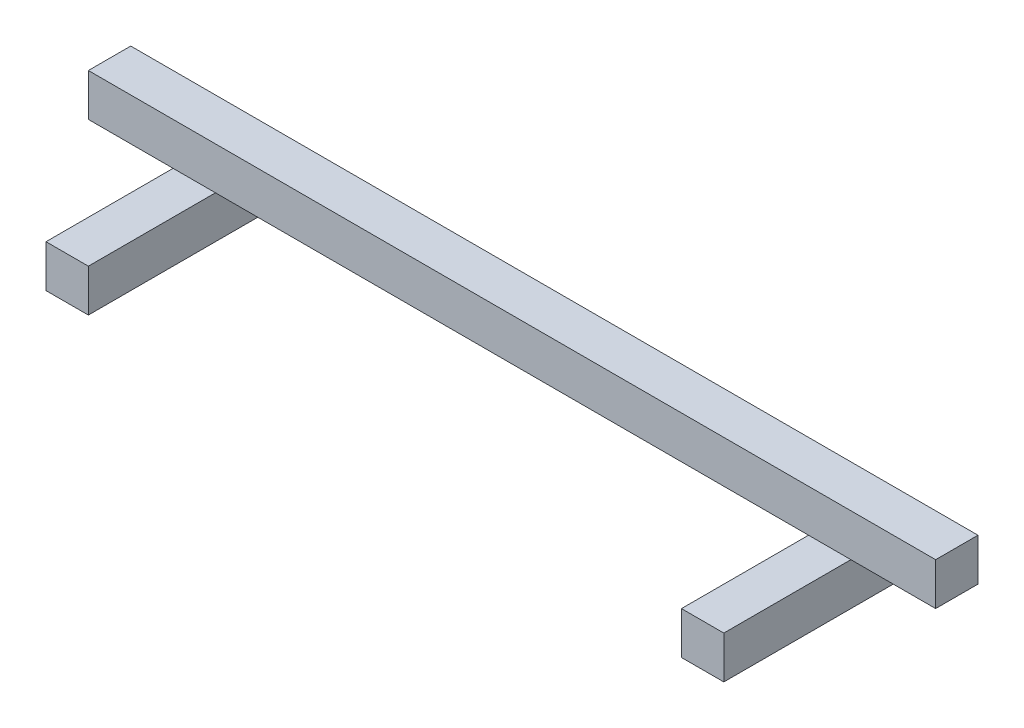
ISO-10303-21;
HEADER;
FILE_DESCRIPTION(('STEP AP214'),'2;1');
FILE_NAME('part.step','',(''),(''),'','','');
FILE_SCHEMA(('AUTOMOTIVE_DESIGN { 1 0 10303 214 1 1 1 1 }'));
ENDSEC;
DATA;
#1=APPLICATION_CONTEXT('core data for automotive mechanical design processes');
#2=APPLICATION_PROTOCOL_DEFINITION('international standard','automotive_design',2000,#1);
#3=PRODUCT_CONTEXT('',#1,'mechanical');
#4=PRODUCT('Part','Part','',(#3));
#5=PRODUCT_RELATED_PRODUCT_CATEGORY('part','',(#4));
#6=PRODUCT_DEFINITION_FORMATION('','',#4);
#7=PRODUCT_DEFINITION_CONTEXT('part definition',#1,'design');
#8=PRODUCT_DEFINITION('design','',#6,#7);
#9=PRODUCT_DEFINITION_SHAPE('','',#8);
#10=(LENGTH_UNIT() NAMED_UNIT(*) SI_UNIT(.MILLI.,.METRE.));
#11=(NAMED_UNIT(*) PLANE_ANGLE_UNIT() SI_UNIT($,.RADIAN.));
#12=(NAMED_UNIT(*) SI_UNIT($,.STERADIAN.) SOLID_ANGLE_UNIT());
#13=UNCERTAINTY_MEASURE_WITH_UNIT(LENGTH_MEASURE(1.E-05),#10,'distance_accuracy_value','');
#14=(GEOMETRIC_REPRESENTATION_CONTEXT(3) GLOBAL_UNCERTAINTY_ASSIGNED_CONTEXT((#13)) GLOBAL_UNIT_ASSIGNED_CONTEXT((#10,
#11,#12)) REPRESENTATION_CONTEXT('',''));
#15=CARTESIAN_POINT('',(0.,0.,0.));
#16=DIRECTION('',(0.,0.,1.));
#17=DIRECTION('',(1.,0.,0.));
#18=AXIS2_PLACEMENT_3D('',#15,#16,#17);
#19=CARTESIAN_POINT('',(304.8,0.,133.35));
#20=DIRECTION('',(0.,-1.,0.));
#21=DIRECTION('',(1.,0.,0.));
#22=AXIS2_PLACEMENT_3D('',#19,#20,#21);
#23=PLANE('',#22);
#24=DIRECTION('',(-1.,0.,0.));
#25=VECTOR('',#24,1.);
#26=CARTESIAN_POINT('',(304.8,0.,-19.05));
#27=LINE('',#26,#25);
#28=CARTESIAN_POINT('',(304.8,0.,-19.05));
#29=VERTEX_POINT('',#28);
#30=CARTESIAN_POINT('',(266.7,0.,-19.05));
#31=VERTEX_POINT('',#30);
#32=EDGE_CURVE('E107',#29,#31,#27,.T.);
#33=ORIENTED_EDGE('',*,*,#32,.T.);
#34=DIRECTION('',(0.,0.,-1.));
#35=VECTOR('',#34,1.);
#36=CARTESIAN_POINT('',(266.7,0.,133.35));
#37=LINE('',#36,#35);
#38=CARTESIAN_POINT('',(266.7,0.,133.35));
#39=VERTEX_POINT('',#38);
#40=EDGE_CURVE('E12',#39,#31,#37,.T.);
#41=ORIENTED_EDGE('',*,*,#40,.F.);
#42=DIRECTION('',(-1.,0.,0.));
#43=VECTOR('',#42,1.);
#44=CARTESIAN_POINT('',(304.8,0.,133.35));
#45=LINE('',#44,#43);
#46=CARTESIAN_POINT('',(304.8,0.,133.35));
#47=VERTEX_POINT('',#46);
#48=EDGE_CURVE('E95',#47,#39,#45,.T.);
#49=ORIENTED_EDGE('',*,*,#48,.F.);
#50=DIRECTION('',(0.,0.,-1.));
#51=VECTOR('',#50,1.);
#52=CARTESIAN_POINT('',(304.8,0.,133.35));
#53=LINE('',#52,#51);
#54=EDGE_CURVE('E103',#47,#29,#53,.T.);
#55=ORIENTED_EDGE('',*,*,#54,.T.);
#56=EDGE_LOOP('',(#33,#41,#49,#55));
#57=FACE_BOUND('',#56,.T.);
#58=ADVANCED_FACE('F44',(#57),#23,.F.);
#59=CARTESIAN_POINT('',(266.7,0.,133.35));
#60=DIRECTION('',(1.,0.,0.));
#61=DIRECTION('',(0.,0.,-1.));
#62=AXIS2_PLACEMENT_3D('',#59,#60,#61);
#63=PLANE('',#62);
#64=DIRECTION('',(0.,-1.,0.));
#65=VECTOR('',#64,1.);
#66=CARTESIAN_POINT('',(266.7,0.,-19.05));
#67=LINE('',#66,#65);
#68=CARTESIAN_POINT('',(266.7,-38.0999999999999,-19.05));
#69=VERTEX_POINT('',#68);
#70=EDGE_CURVE('E99',#31,#69,#67,.T.);
#71=ORIENTED_EDGE('',*,*,#70,.T.);
#72=DIRECTION('',(0.,0.,-1.));
#73=VECTOR('',#72,1.);
#74=CARTESIAN_POINT('',(266.7,-38.0999999999999,133.35));
#75=LINE('',#74,#73);
#76=CARTESIAN_POINT('',(266.7,-38.0999999999999,133.35));
#77=VERTEX_POINT('',#76);
#78=EDGE_CURVE('E52',#77,#69,#75,.T.);
#79=ORIENTED_EDGE('',*,*,#78,.F.);
#80=DIRECTION('',(0.,-1.,0.));
#81=VECTOR('',#80,1.);
#82=CARTESIAN_POINT('',(266.7,0.,133.35));
#83=LINE('',#82,#81);
#84=EDGE_CURVE('E90',#39,#77,#83,.T.);
#85=ORIENTED_EDGE('',*,*,#84,.F.);
#86=ORIENTED_EDGE('',*,*,#40,.T.);
#87=EDGE_LOOP('',(#71,#79,#85,#86));
#88=FACE_BOUND('',#87,.T.);
#89=ADVANCED_FACE('F98',(#88),#63,.F.);
#90=CARTESIAN_POINT('',(304.8,-38.0999999999999,133.35));
#91=DIRECTION('',(0.,1.,0.));
#92=DIRECTION('',(-1.,0.,0.));
#93=AXIS2_PLACEMENT_3D('',#90,#91,#92);
#94=PLANE('',#93);
#95=DIRECTION('',(1.,0.,0.));
#96=VECTOR('',#95,1.);
#97=CARTESIAN_POINT('',(304.8,-38.0999999999999,-19.05));
#98=LINE('',#97,#96);
#99=CARTESIAN_POINT('',(304.8,-38.0999999999999,-19.05));
#100=VERTEX_POINT('',#99);
#101=EDGE_CURVE('E77',#69,#100,#98,.T.);
#102=ORIENTED_EDGE('',*,*,#101,.T.);
#103=DIRECTION('',(0.,0.,-1.));
#104=VECTOR('',#103,1.);
#105=CARTESIAN_POINT('',(304.8,-38.0999999999999,133.35));
#106=LINE('',#105,#104);
#107=CARTESIAN_POINT('',(304.8,-38.0999999999999,133.35));
#108=VERTEX_POINT('',#107);
#109=EDGE_CURVE('E100',#108,#100,#106,.T.);
#110=ORIENTED_EDGE('',*,*,#109,.F.);
#111=DIRECTION('',(1.,0.,0.));
#112=VECTOR('',#111,1.);
#113=CARTESIAN_POINT('',(304.8,-38.0999999999999,133.35));
#114=LINE('',#113,#112);
#115=EDGE_CURVE('E93',#77,#108,#114,.T.);
#116=ORIENTED_EDGE('',*,*,#115,.F.);
#117=ORIENTED_EDGE('',*,*,#78,.T.);
#118=EDGE_LOOP('',(#102,#110,#116,#117));
#119=FACE_BOUND('',#118,.T.);
#120=ADVANCED_FACE('F101',(#119),#94,.F.);
#121=CARTESIAN_POINT('',(304.8,0.,133.35));
#122=DIRECTION('',(-1.,0.,0.));
#123=DIRECTION('',(0.,0.,1.));
#124=AXIS2_PLACEMENT_3D('',#121,#122,#123);
#125=PLANE('',#124);
#126=DIRECTION('',(0.,1.,0.));
#127=VECTOR('',#126,1.);
#128=CARTESIAN_POINT('',(304.8,0.,-19.05));
#129=LINE('',#128,#127);
#130=EDGE_CURVE('E83',#100,#29,#129,.T.);
#131=ORIENTED_EDGE('',*,*,#130,.T.);
#132=ORIENTED_EDGE('',*,*,#54,.F.);
#133=DIRECTION('',(0.,1.,0.));
#134=VECTOR('',#133,1.);
#135=CARTESIAN_POINT('',(304.8,0.,133.35));
#136=LINE('',#135,#134);
#137=EDGE_CURVE('E60',#108,#47,#136,.T.);
#138=ORIENTED_EDGE('',*,*,#137,.F.);
#139=ORIENTED_EDGE('',*,*,#109,.T.);
#140=EDGE_LOOP('',(#131,#132,#138,#139));
#141=FACE_BOUND('',#140,.T.);
#142=ADVANCED_FACE('F114',(#141),#125,.F.);
#143=CARTESIAN_POINT('',(0.,0.,133.35));
#144=DIRECTION('',(0.,0.,1.));
#145=DIRECTION('',(1.,0.,0.));
#146=AXIS2_PLACEMENT_3D('',#143,#144,#145);
#147=PLANE('',#146);
#148=ORIENTED_EDGE('',*,*,#48,.T.);
#149=ORIENTED_EDGE('',*,*,#84,.T.);
#150=ORIENTED_EDGE('',*,*,#115,.T.);
#151=ORIENTED_EDGE('',*,*,#137,.T.);
#152=EDGE_LOOP('',(#148,#149,#150,#151));
#153=FACE_BOUND('',#152,.T.);
#154=ADVANCED_FACE('F91',(#153),#147,.T.);
#155=CARTESIAN_POINT('',(0.,0.,-19.05));
#156=DIRECTION('',(0.,0.,1.));
#157=DIRECTION('',(1.,0.,0.));
#158=AXIS2_PLACEMENT_3D('',#155,#156,#157);
#159=PLANE('',#158);
#160=ORIENTED_EDGE('',*,*,#32,.F.);
#161=ORIENTED_EDGE('',*,*,#130,.F.);
#162=ORIENTED_EDGE('',*,*,#101,.F.);
#163=ORIENTED_EDGE('',*,*,#70,.F.);
#164=EDGE_LOOP('',(#160,#161,#162,#163));
#165=FACE_BOUND('',#164,.T.);
#166=ADVANCED_FACE('F117',(#165),#159,.F.);
#167=CLOSED_SHELL('',(#58,#89,#120,#142,#154,#166));
#168=MANIFOLD_SOLID_BREP('B2',#167);
#169=CARTESIAN_POINT('',(-304.8,0.,133.35));
#170=DIRECTION('',(1.,0.,0.));
#171=DIRECTION('',(0.,0.,-1.));
#172=AXIS2_PLACEMENT_3D('',#169,#170,#171);
#173=PLANE('',#172);
#174=DIRECTION('',(0.,-1.,0.));
#175=VECTOR('',#174,1.);
#176=CARTESIAN_POINT('',(-304.8,0.,-19.05));
#177=LINE('',#176,#175);
#178=CARTESIAN_POINT('',(-304.8,0.,-19.05));
#179=VERTEX_POINT('',#178);
#180=CARTESIAN_POINT('',(-304.8,-38.1,-19.05));
#181=VERTEX_POINT('',#180);
#182=EDGE_CURVE('E240',#179,#181,#177,.T.);
#183=ORIENTED_EDGE('',*,*,#182,.T.);
#184=DIRECTION('',(0.,0.,-1.));
#185=VECTOR('',#184,1.);
#186=CARTESIAN_POINT('',(-304.8,-38.1,133.35));
#187=LINE('',#186,#185);
#188=CARTESIAN_POINT('',(-304.8,-38.1,133.35));
#189=VERTEX_POINT('',#188);
#190=EDGE_CURVE('E42',#189,#181,#187,.T.);
#191=ORIENTED_EDGE('',*,*,#190,.F.);
#192=DIRECTION('',(0.,-1.,0.));
#193=VECTOR('',#192,1.);
#194=CARTESIAN_POINT('',(-304.8,0.,133.35));
#195=LINE('',#194,#193);
#196=CARTESIAN_POINT('',(-304.8,0.,133.35));
#197=VERTEX_POINT('',#196);
#198=EDGE_CURVE('E228',#197,#189,#195,.T.);
#199=ORIENTED_EDGE('',*,*,#198,.F.);
#200=DIRECTION('',(0.,0.,-1.));
#201=VECTOR('',#200,1.);
#202=CARTESIAN_POINT('',(-304.8,0.,133.35));
#203=LINE('',#202,#201);
#204=EDGE_CURVE('E236',#197,#179,#203,.T.);
#205=ORIENTED_EDGE('',*,*,#204,.T.);
#206=EDGE_LOOP('',(#183,#191,#199,#205));
#207=FACE_BOUND('',#206,.T.);
#208=ADVANCED_FACE('F177',(#207),#173,.F.);
#209=CARTESIAN_POINT('',(-304.8,-38.1,133.35));
#210=DIRECTION('',(0.,1.,0.));
#211=DIRECTION('',(0.,0.,1.));
#212=AXIS2_PLACEMENT_3D('',#209,#210,#211);
#213=PLANE('',#212);
#214=DIRECTION('',(1.,0.,0.));
#215=VECTOR('',#214,1.);
#216=CARTESIAN_POINT('',(-304.8,-38.1,-19.05));
#217=LINE('',#216,#215);
#218=CARTESIAN_POINT('',(-266.7,-38.1,-19.05));
#219=VERTEX_POINT('',#218);
#220=EDGE_CURVE('E232',#181,#219,#217,.T.);
#221=ORIENTED_EDGE('',*,*,#220,.T.);
#222=DIRECTION('',(0.,0.,-1.));
#223=VECTOR('',#222,1.);
#224=CARTESIAN_POINT('',(-266.7,-38.1,133.35));
#225=LINE('',#224,#223);
#226=CARTESIAN_POINT('',(-266.7,-38.1,133.35));
#227=VERTEX_POINT('',#226);
#228=EDGE_CURVE('E185',#227,#219,#225,.T.);
#229=ORIENTED_EDGE('',*,*,#228,.F.);
#230=DIRECTION('',(1.,0.,0.));
#231=VECTOR('',#230,1.);
#232=CARTESIAN_POINT('',(-304.8,-38.1,133.35));
#233=LINE('',#232,#231);
#234=EDGE_CURVE('E223',#189,#227,#233,.T.);
#235=ORIENTED_EDGE('',*,*,#234,.F.);
#236=ORIENTED_EDGE('',*,*,#190,.T.);
#237=EDGE_LOOP('',(#221,#229,#235,#236));
#238=FACE_BOUND('',#237,.T.);
#239=ADVANCED_FACE('F231',(#238),#213,.F.);
#240=CARTESIAN_POINT('',(-266.7,0.,133.35));
#241=DIRECTION('',(-1.,0.,0.));
#242=DIRECTION('',(0.,0.,1.));
#243=AXIS2_PLACEMENT_3D('',#240,#241,#242);
#244=PLANE('',#243);
#245=DIRECTION('',(0.,1.,0.));
#246=VECTOR('',#245,1.);
#247=CARTESIAN_POINT('',(-266.7,0.,-19.05));
#248=LINE('',#247,#246);
#249=CARTESIAN_POINT('',(-266.7,0.,-19.05));
#250=VERTEX_POINT('',#249);
#251=EDGE_CURVE('E210',#219,#250,#248,.T.);
#252=ORIENTED_EDGE('',*,*,#251,.T.);
#253=DIRECTION('',(0.,0.,-1.));
#254=VECTOR('',#253,1.);
#255=CARTESIAN_POINT('',(-266.7,0.,133.35));
#256=LINE('',#255,#254);
#257=CARTESIAN_POINT('',(-266.7,0.,133.35));
#258=VERTEX_POINT('',#257);
#259=EDGE_CURVE('E233',#258,#250,#256,.T.);
#260=ORIENTED_EDGE('',*,*,#259,.F.);
#261=DIRECTION('',(0.,1.,0.));
#262=VECTOR('',#261,1.);
#263=CARTESIAN_POINT('',(-266.7,0.,133.35));
#264=LINE('',#263,#262);
#265=EDGE_CURVE('E226',#227,#258,#264,.T.);
#266=ORIENTED_EDGE('',*,*,#265,.F.);
#267=ORIENTED_EDGE('',*,*,#228,.T.);
#268=EDGE_LOOP('',(#252,#260,#266,#267));
#269=FACE_BOUND('',#268,.T.);
#270=ADVANCED_FACE('F234',(#269),#244,.F.);
#271=CARTESIAN_POINT('',(-304.8,0.,133.35));
#272=DIRECTION('',(0.,-1.,0.));
#273=DIRECTION('',(0.,0.,-1.));
#274=AXIS2_PLACEMENT_3D('',#271,#272,#273);
#275=PLANE('',#274);
#276=DIRECTION('',(-1.,0.,0.));
#277=VECTOR('',#276,1.);
#278=CARTESIAN_POINT('',(-304.8,0.,-19.05));
#279=LINE('',#278,#277);
#280=EDGE_CURVE('E216',#250,#179,#279,.T.);
#281=ORIENTED_EDGE('',*,*,#280,.T.);
#282=ORIENTED_EDGE('',*,*,#204,.F.);
#283=DIRECTION('',(-1.,0.,0.));
#284=VECTOR('',#283,1.);
#285=CARTESIAN_POINT('',(-304.8,0.,133.35));
#286=LINE('',#285,#284);
#287=EDGE_CURVE('E193',#258,#197,#286,.T.);
#288=ORIENTED_EDGE('',*,*,#287,.F.);
#289=ORIENTED_EDGE('',*,*,#259,.T.);
#290=EDGE_LOOP('',(#281,#282,#288,#289));
#291=FACE_BOUND('',#290,.T.);
#292=ADVANCED_FACE('F247',(#291),#275,.F.);
#293=CARTESIAN_POINT('',(0.,0.,133.35));
#294=DIRECTION('',(0.,0.,1.));
#295=DIRECTION('',(1.,0.,0.));
#296=AXIS2_PLACEMENT_3D('',#293,#294,#295);
#297=PLANE('',#296);
#298=ORIENTED_EDGE('',*,*,#198,.T.);
#299=ORIENTED_EDGE('',*,*,#234,.T.);
#300=ORIENTED_EDGE('',*,*,#265,.T.);
#301=ORIENTED_EDGE('',*,*,#287,.T.);
#302=EDGE_LOOP('',(#298,#299,#300,#301));
#303=FACE_BOUND('',#302,.T.);
#304=ADVANCED_FACE('F224',(#303),#297,.T.);
#305=CARTESIAN_POINT('',(0.,0.,-19.05));
#306=DIRECTION('',(0.,0.,1.));
#307=DIRECTION('',(1.,0.,0.));
#308=AXIS2_PLACEMENT_3D('',#305,#306,#307);
#309=PLANE('',#308);
#310=ORIENTED_EDGE('',*,*,#182,.F.);
#311=ORIENTED_EDGE('',*,*,#280,.F.);
#312=ORIENTED_EDGE('',*,*,#251,.F.);
#313=ORIENTED_EDGE('',*,*,#220,.F.);
#314=EDGE_LOOP('',(#310,#311,#312,#313));
#315=FACE_BOUND('',#314,.T.);
#316=ADVANCED_FACE('F250',(#315),#309,.F.);
#317=CLOSED_SHELL('',(#208,#239,#270,#292,#304,#316));
#318=MANIFOLD_SOLID_BREP('B6',#317);
#319=CARTESIAN_POINT('',(-381.,38.1,-19.05));
#320=DIRECTION('',(1.,0.,0.));
#321=DIRECTION('',(0.,0.,-1.));
#322=AXIS2_PLACEMENT_3D('',#319,#320,#321);
#323=PLANE('',#322);
#324=DIRECTION('',(0.,0.,1.));
#325=VECTOR('',#324,1.);
#326=CARTESIAN_POINT('',(-381.,0.,-19.05));
#327=LINE('',#326,#325);
#328=CARTESIAN_POINT('',(-381.,0.,-19.05));
#329=VERTEX_POINT('',#328);
#330=CARTESIAN_POINT('',(-381.,0.,19.05));
#331=VERTEX_POINT('',#330);
#332=EDGE_CURVE('E364',#329,#331,#327,.T.);
#333=ORIENTED_EDGE('',*,*,#332,.T.);
#334=DIRECTION('',(0.,-1.,0.));
#335=VECTOR('',#334,1.);
#336=CARTESIAN_POINT('',(-381.,38.1,19.05));
#337=LINE('',#336,#335);
#338=CARTESIAN_POINT('',(-381.,38.1,19.05));
#339=VERTEX_POINT('',#338);
#340=EDGE_CURVE('E175',#339,#331,#337,.T.);
#341=ORIENTED_EDGE('',*,*,#340,.F.);
#342=DIRECTION('',(0.,0.,1.));
#343=VECTOR('',#342,1.);
#344=CARTESIAN_POINT('',(-381.,38.1,-19.05));
#345=LINE('',#344,#343);
#346=CARTESIAN_POINT('',(-381.,38.1,-19.05));
#347=VERTEX_POINT('',#346);
#348=EDGE_CURVE('E352',#347,#339,#345,.T.);
#349=ORIENTED_EDGE('',*,*,#348,.F.);
#350=DIRECTION('',(0.,-1.,0.));
#351=VECTOR('',#350,1.);
#352=CARTESIAN_POINT('',(-381.,38.1,-19.05));
#353=LINE('',#352,#351);
#354=EDGE_CURVE('E360',#347,#329,#353,.T.);
#355=ORIENTED_EDGE('',*,*,#354,.T.);
#356=EDGE_LOOP('',(#333,#341,#349,#355));
#357=FACE_BOUND('',#356,.T.);
#358=ADVANCED_FACE('F301',(#357),#323,.F.);
#359=CARTESIAN_POINT('',(-381.,38.1,19.05));
#360=DIRECTION('',(0.,0.,-1.));
#361=DIRECTION('',(-1.,0.,0.));
#362=AXIS2_PLACEMENT_3D('',#359,#360,#361);
#363=PLANE('',#362);
#364=DIRECTION('',(1.,0.,0.));
#365=VECTOR('',#364,1.);
#366=CARTESIAN_POINT('',(-381.,0.,19.05));
#367=LINE('',#366,#365);
#368=CARTESIAN_POINT('',(381.,0.,19.05));
#369=VERTEX_POINT('',#368);
#370=EDGE_CURVE('E356',#331,#369,#367,.T.);
#371=ORIENTED_EDGE('',*,*,#370,.T.);
#372=DIRECTION('',(0.,-1.,0.));
#373=VECTOR('',#372,1.);
#374=CARTESIAN_POINT('',(381.,38.1,19.05));
#375=LINE('',#374,#373);
#376=CARTESIAN_POINT('',(381.,38.1,19.05));
#377=VERTEX_POINT('',#376);
#378=EDGE_CURVE('E309',#377,#369,#375,.T.);
#379=ORIENTED_EDGE('',*,*,#378,.F.);
#380=DIRECTION('',(1.,0.,0.));
#381=VECTOR('',#380,1.);
#382=CARTESIAN_POINT('',(-381.,38.1,19.05));
#383=LINE('',#382,#381);
#384=EDGE_CURVE('E347',#339,#377,#383,.T.);
#385=ORIENTED_EDGE('',*,*,#384,.F.);
#386=ORIENTED_EDGE('',*,*,#340,.T.);
#387=EDGE_LOOP('',(#371,#379,#385,#386));
#388=FACE_BOUND('',#387,.T.);
#389=ADVANCED_FACE('F355',(#388),#363,.F.);
#390=CARTESIAN_POINT('',(381.,38.1,-19.05));
#391=DIRECTION('',(-1.,0.,0.));
#392=DIRECTION('',(0.,0.,1.));
#393=AXIS2_PLACEMENT_3D('',#390,#391,#392);
#394=PLANE('',#393);
#395=DIRECTION('',(0.,0.,-1.));
#396=VECTOR('',#395,1.);
#397=CARTESIAN_POINT('',(381.,0.,-19.05));
#398=LINE('',#397,#396);
#399=CARTESIAN_POINT('',(381.,0.,-19.05));
#400=VERTEX_POINT('',#399);
#401=EDGE_CURVE('E334',#369,#400,#398,.T.);
#402=ORIENTED_EDGE('',*,*,#401,.T.);
#403=DIRECTION('',(0.,-1.,0.));
#404=VECTOR('',#403,1.);
#405=CARTESIAN_POINT('',(381.,38.1,-19.05));
#406=LINE('',#405,#404);
#407=CARTESIAN_POINT('',(381.,38.1,-19.05));
#408=VERTEX_POINT('',#407);
#409=EDGE_CURVE('E357',#408,#400,#406,.T.);
#410=ORIENTED_EDGE('',*,*,#409,.F.);
#411=DIRECTION('',(0.,0.,-1.));
#412=VECTOR('',#411,1.);
#413=CARTESIAN_POINT('',(381.,38.1,-19.05));
#414=LINE('',#413,#412);
#415=EDGE_CURVE('E350',#377,#408,#414,.T.);
#416=ORIENTED_EDGE('',*,*,#415,.F.);
#417=ORIENTED_EDGE('',*,*,#378,.T.);
#418=EDGE_LOOP('',(#402,#410,#416,#417));
#419=FACE_BOUND('',#418,.T.);
#420=ADVANCED_FACE('F358',(#419),#394,.F.);
#421=CARTESIAN_POINT('',(-381.,38.1,-19.05));
#422=DIRECTION('',(0.,0.,1.));
#423=DIRECTION('',(1.,0.,0.));
#424=AXIS2_PLACEMENT_3D('',#421,#422,#423);
#425=PLANE('',#424);
#426=DIRECTION('',(-1.,0.,0.));
#427=VECTOR('',#426,1.);
#428=CARTESIAN_POINT('',(-381.,0.,-19.05));
#429=LINE('',#428,#427);
#430=EDGE_CURVE('E340',#400,#329,#429,.T.);
#431=ORIENTED_EDGE('',*,*,#430,.T.);
#432=ORIENTED_EDGE('',*,*,#354,.F.);
#433=DIRECTION('',(-1.,0.,0.));
#434=VECTOR('',#433,1.);
#435=CARTESIAN_POINT('',(-381.,38.1,-19.05));
#436=LINE('',#435,#434);
#437=EDGE_CURVE('E317',#408,#347,#436,.T.);
#438=ORIENTED_EDGE('',*,*,#437,.F.);
#439=ORIENTED_EDGE('',*,*,#409,.T.);
#440=EDGE_LOOP('',(#431,#432,#438,#439));
#441=FACE_BOUND('',#440,.T.);
#442=ADVANCED_FACE('F371',(#441),#425,.F.);
#443=CARTESIAN_POINT('',(0.,38.1,0.));
#444=DIRECTION('',(0.,1.,0.));
#445=DIRECTION('',(0.,0.,1.));
#446=AXIS2_PLACEMENT_3D('',#443,#444,#445);
#447=PLANE('',#446);
#448=ORIENTED_EDGE('',*,*,#348,.T.);
#449=ORIENTED_EDGE('',*,*,#384,.T.);
#450=ORIENTED_EDGE('',*,*,#415,.T.);
#451=ORIENTED_EDGE('',*,*,#437,.T.);
#452=EDGE_LOOP('',(#448,#449,#450,#451));
#453=FACE_BOUND('',#452,.T.);
#454=ADVANCED_FACE('F348',(#453),#447,.T.);
#455=CARTESIAN_POINT('',(0.,0.,0.));
#456=DIRECTION('',(0.,1.,0.));
#457=DIRECTION('',(0.,0.,1.));
#458=AXIS2_PLACEMENT_3D('',#455,#456,#457);
#459=PLANE('',#458);
#460=ORIENTED_EDGE('',*,*,#332,.F.);
#461=ORIENTED_EDGE('',*,*,#430,.F.);
#462=ORIENTED_EDGE('',*,*,#401,.F.);
#463=ORIENTED_EDGE('',*,*,#370,.F.);
#464=EDGE_LOOP('',(#460,#461,#462,#463));
#465=FACE_BOUND('',#464,.T.);
#466=ADVANCED_FACE('F374',(#465),#459,.F.);
#467=CLOSED_SHELL('',(#358,#389,#420,#442,#454,#466));
#468=MANIFOLD_SOLID_BREP('B36',#467);
#469=ADVANCED_BREP_SHAPE_REPRESENTATION('',(#18,#168,#318,#468),#14);
#470=SHAPE_DEFINITION_REPRESENTATION(#9,#469);
ENDSEC;
END-ISO-10303-21;
